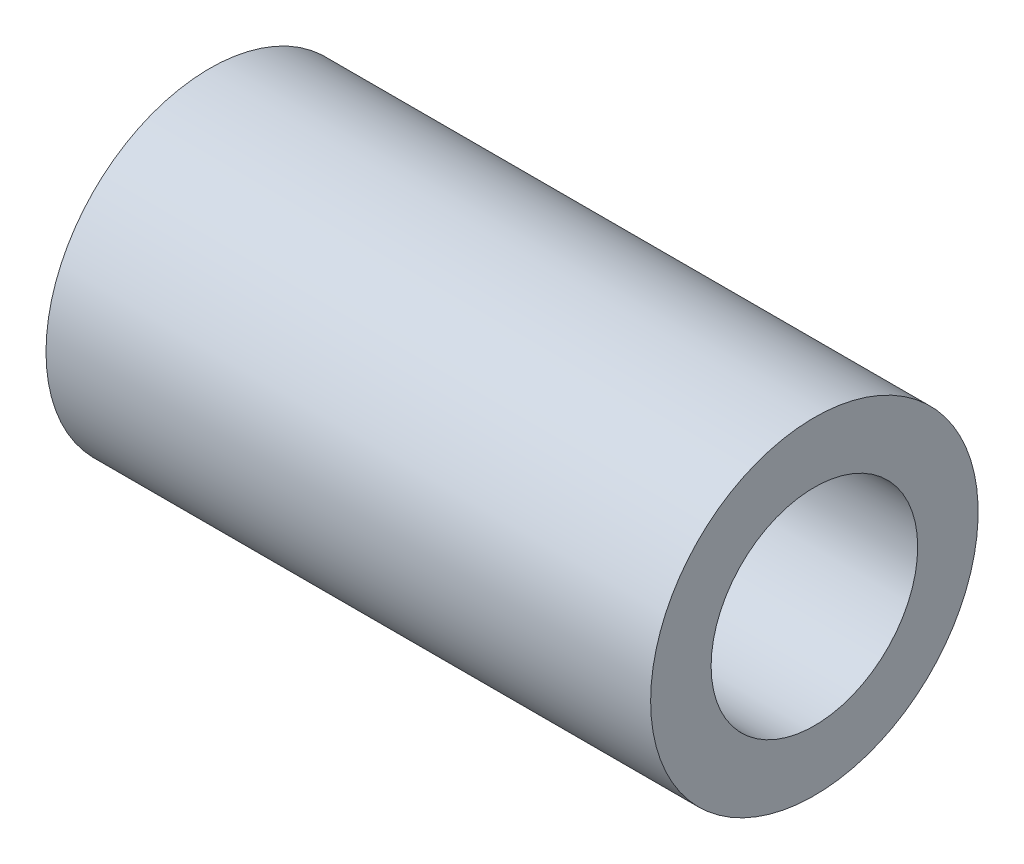
ISO-10303-21;
HEADER;
FILE_DESCRIPTION(('STEP AP214'),'2;1');
FILE_NAME('part.step','',(''),(''),'','','');
FILE_SCHEMA(('AUTOMOTIVE_DESIGN { 1 0 10303 214 1 1 1 1 }'));
ENDSEC;
DATA;
#1=APPLICATION_CONTEXT('core data for automotive mechanical design processes');
#2=APPLICATION_PROTOCOL_DEFINITION('international standard','automotive_design',2000,#1);
#3=PRODUCT_CONTEXT('',#1,'mechanical');
#4=PRODUCT('Part','Part','',(#3));
#5=PRODUCT_RELATED_PRODUCT_CATEGORY('part','',(#4));
#6=PRODUCT_DEFINITION_FORMATION('','',#4);
#7=PRODUCT_DEFINITION_CONTEXT('part definition',#1,'design');
#8=PRODUCT_DEFINITION('design','',#6,#7);
#9=PRODUCT_DEFINITION_SHAPE('','',#8);
#10=(LENGTH_UNIT() NAMED_UNIT(*) SI_UNIT(.MILLI.,.METRE.));
#11=(NAMED_UNIT(*) PLANE_ANGLE_UNIT() SI_UNIT($,.RADIAN.));
#12=(NAMED_UNIT(*) SI_UNIT($,.STERADIAN.) SOLID_ANGLE_UNIT());
#13=UNCERTAINTY_MEASURE_WITH_UNIT(LENGTH_MEASURE(1.E-05),#10,'distance_accuracy_value','');
#14=(GEOMETRIC_REPRESENTATION_CONTEXT(3) GLOBAL_UNCERTAINTY_ASSIGNED_CONTEXT((#13)) GLOBAL_UNIT_ASSIGNED_CONTEXT((#10,
#11,#12)) REPRESENTATION_CONTEXT('',''));
#15=CARTESIAN_POINT('',(0.,0.,0.));
#16=DIRECTION('',(0.,0.,1.));
#17=DIRECTION('',(1.,0.,0.));
#18=AXIS2_PLACEMENT_3D('',#15,#16,#17);
#19=CARTESIAN_POINT('',(0.,0.,0.));
#20=DIRECTION('',(-1.,0.,0.));
#21=DIRECTION('',(0.,0.,1.));
#22=AXIS2_PLACEMENT_3D('',#19,#20,#21);
#23=CYLINDRICAL_SURFACE('',#22,2.35);
#24=CARTESIAN_POINT('',(8.,0.,0.));
#25=DIRECTION('',(-1.,0.,0.));
#26=DIRECTION('',(0.,0.,1.));
#27=AXIS2_PLACEMENT_3D('',#24,#25,#26);
#28=CIRCLE('',#27,2.35);
#29=CARTESIAN_POINT('',(8.,0.,2.35));
#30=VERTEX_POINT('',#29);
#31=EDGE_CURVE('E54',#30,#30,#28,.T.);
#32=ORIENTED_EDGE('',*,*,#31,.F.);
#33=EDGE_LOOP('',(#32));
#34=FACE_BOUND('',#33,.T.);
#35=CARTESIAN_POINT('',(0.,0.,0.));
#36=DIRECTION('',(-1.,0.,0.));
#37=DIRECTION('',(0.,0.,1.));
#38=AXIS2_PLACEMENT_3D('',#35,#36,#37);
#39=CIRCLE('',#38,2.35);
#40=CARTESIAN_POINT('',(0.,0.,2.35));
#41=VERTEX_POINT('',#40);
#42=EDGE_CURVE('E10',#41,#41,#39,.T.);
#43=ORIENTED_EDGE('',*,*,#42,.T.);
#44=EDGE_LOOP('',(#43));
#45=FACE_BOUND('',#44,.T.);
#46=ADVANCED_FACE('F32',(#34,#45),#23,.F.);
#47=CARTESIAN_POINT('',(0.,0.,-3.25));
#48=DIRECTION('',(1.,0.,0.));
#49=DIRECTION('',(0.,0.,-1.));
#50=AXIS2_PLACEMENT_3D('',#47,#48,#49);
#51=PLANE('',#50);
#52=ORIENTED_EDGE('',*,*,#42,.F.);
#53=EDGE_LOOP('',(#52));
#54=FACE_BOUND('',#53,.T.);
#55=CARTESIAN_POINT('',(0.,0.,0.));
#56=DIRECTION('',(-1.,0.,0.));
#57=DIRECTION('',(0.,0.,1.));
#58=AXIS2_PLACEMENT_3D('',#55,#56,#57);
#59=CIRCLE('',#58,3.25);
#60=CARTESIAN_POINT('',(0.,0.,3.25));
#61=VERTEX_POINT('',#60);
#62=EDGE_CURVE('E38',#61,#61,#59,.T.);
#63=ORIENTED_EDGE('',*,*,#62,.T.);
#64=EDGE_LOOP('',(#63));
#65=FACE_BOUND('',#64,.T.);
#66=ADVANCED_FACE('F61',(#54,#65),#51,.F.);
#67=CARTESIAN_POINT('',(0.,0.,0.));
#68=DIRECTION('',(-1.,0.,0.));
#69=DIRECTION('',(0.,0.,1.));
#70=AXIS2_PLACEMENT_3D('',#67,#68,#69);
#71=CYLINDRICAL_SURFACE('',#70,3.25);
#72=ORIENTED_EDGE('',*,*,#62,.F.);
#73=EDGE_LOOP('',(#72));
#74=FACE_BOUND('',#73,.T.);
#75=CARTESIAN_POINT('',(12.,0.,0.));
#76=DIRECTION('',(-1.,0.,0.));
#77=DIRECTION('',(0.,0.,1.));
#78=AXIS2_PLACEMENT_3D('',#75,#76,#77);
#79=CIRCLE('',#78,3.25);
#80=CARTESIAN_POINT('',(12.,0.,3.25));
#81=VERTEX_POINT('',#80);
#82=EDGE_CURVE('E42',#81,#81,#79,.T.);
#83=ORIENTED_EDGE('',*,*,#82,.T.);
#84=EDGE_LOOP('',(#83));
#85=FACE_BOUND('',#84,.T.);
#86=ADVANCED_FACE('F65',(#74,#85),#71,.T.);
#87=CARTESIAN_POINT('',(12.,0.,-2.05));
#88=DIRECTION('',(-1.,0.,0.));
#89=DIRECTION('',(0.,0.,1.));
#90=AXIS2_PLACEMENT_3D('',#87,#88,#89);
#91=PLANE('',#90);
#92=ORIENTED_EDGE('',*,*,#82,.F.);
#93=EDGE_LOOP('',(#92));
#94=FACE_BOUND('',#93,.T.);
#95=CARTESIAN_POINT('',(12.,0.,0.));
#96=DIRECTION('',(-1.,0.,0.));
#97=DIRECTION('',(0.,0.,1.));
#98=AXIS2_PLACEMENT_3D('',#95,#96,#97);
#99=CIRCLE('',#98,2.05);
#100=CARTESIAN_POINT('',(12.,0.,2.05));
#101=VERTEX_POINT('',#100);
#102=EDGE_CURVE('E46',#101,#101,#99,.T.);
#103=ORIENTED_EDGE('',*,*,#102,.T.);
#104=EDGE_LOOP('',(#103));
#105=FACE_BOUND('',#104,.T.);
#106=ADVANCED_FACE('F70',(#94,#105),#91,.F.);
#107=CARTESIAN_POINT('',(0.,0.,0.));
#108=DIRECTION('',(-1.,0.,0.));
#109=DIRECTION('',(0.,0.,1.));
#110=AXIS2_PLACEMENT_3D('',#107,#108,#109);
#111=CYLINDRICAL_SURFACE('',#110,2.05);
#112=ORIENTED_EDGE('',*,*,#102,.F.);
#113=EDGE_LOOP('',(#112));
#114=FACE_BOUND('',#113,.T.);
#115=CARTESIAN_POINT('',(8.,0.,0.));
#116=DIRECTION('',(-1.,0.,0.));
#117=DIRECTION('',(0.,0.,1.));
#118=AXIS2_PLACEMENT_3D('',#115,#116,#117);
#119=CIRCLE('',#118,2.05);
#120=CARTESIAN_POINT('',(8.,0.,2.05));
#121=VERTEX_POINT('',#120);
#122=EDGE_CURVE('E51',#121,#121,#119,.T.);
#123=ORIENTED_EDGE('',*,*,#122,.T.);
#124=EDGE_LOOP('',(#123));
#125=FACE_BOUND('',#124,.T.);
#126=ADVANCED_FACE('F76',(#114,#125),#111,.F.);
#127=CARTESIAN_POINT('',(8.,0.,-2.35));
#128=DIRECTION('',(1.,0.,0.));
#129=DIRECTION('',(0.,0.,-1.));
#130=AXIS2_PLACEMENT_3D('',#127,#128,#129);
#131=PLANE('',#130);
#132=ORIENTED_EDGE('',*,*,#122,.F.);
#133=EDGE_LOOP('',(#132));
#134=FACE_BOUND('',#133,.T.);
#135=ORIENTED_EDGE('',*,*,#31,.T.);
#136=EDGE_LOOP('',(#135));
#137=FACE_BOUND('',#136,.T.);
#138=ADVANCED_FACE('F58',(#134,#137),#131,.F.);
#139=CLOSED_SHELL('',(#46,#66,#86,#106,#126,#138));
#140=MANIFOLD_SOLID_BREP('B2',#139);
#141=ADVANCED_BREP_SHAPE_REPRESENTATION('',(#18,#140),#14);
#142=SHAPE_DEFINITION_REPRESENTATION(#9,#141);
ENDSEC;
END-ISO-10303-21;
